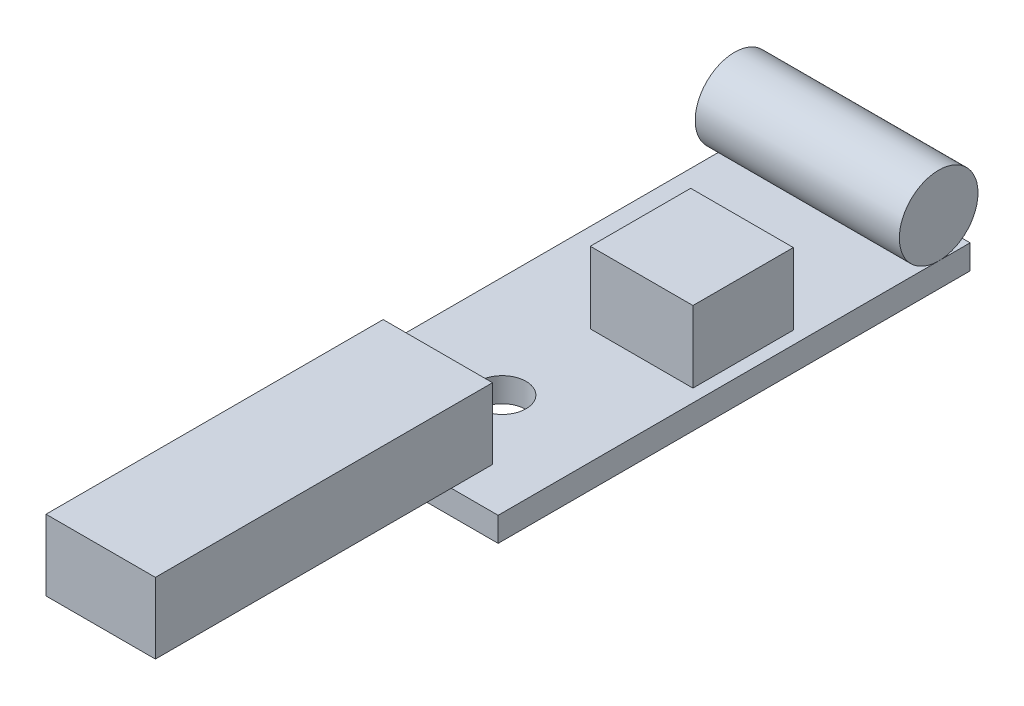
ISO-10303-21;
HEADER;
FILE_DESCRIPTION(('STEP AP214'),'2;1');
FILE_NAME('part.step','',(''),(''),'','','');
FILE_SCHEMA(('AUTOMOTIVE_DESIGN { 1 0 10303 214 1 1 1 1 }'));
ENDSEC;
DATA;
#1=APPLICATION_CONTEXT('core data for automotive mechanical design processes');
#2=APPLICATION_PROTOCOL_DEFINITION('international standard','automotive_design',2000,#1);
#3=PRODUCT_CONTEXT('',#1,'mechanical');
#4=PRODUCT('Part','Part','',(#3));
#5=PRODUCT_RELATED_PRODUCT_CATEGORY('part','',(#4));
#6=PRODUCT_DEFINITION_FORMATION('','',#4);
#7=PRODUCT_DEFINITION_CONTEXT('part definition',#1,'design');
#8=PRODUCT_DEFINITION('design','',#6,#7);
#9=PRODUCT_DEFINITION_SHAPE('','',#8);
#10=(LENGTH_UNIT() NAMED_UNIT(*) SI_UNIT(.MILLI.,.METRE.));
#11=(NAMED_UNIT(*) PLANE_ANGLE_UNIT() SI_UNIT($,.RADIAN.));
#12=(NAMED_UNIT(*) SI_UNIT($,.STERADIAN.) SOLID_ANGLE_UNIT());
#13=UNCERTAINTY_MEASURE_WITH_UNIT(LENGTH_MEASURE(1.E-05),#10,'distance_accuracy_value','');
#14=(GEOMETRIC_REPRESENTATION_CONTEXT(3) GLOBAL_UNCERTAINTY_ASSIGNED_CONTEXT((#13)) GLOBAL_UNIT_ASSIGNED_CONTEXT((#10,
#11,#12)) REPRESENTATION_CONTEXT('',''));
#15=CARTESIAN_POINT('',(0.,0.,0.));
#16=DIRECTION('',(0.,0.,1.));
#17=DIRECTION('',(1.,0.,0.));
#18=AXIS2_PLACEMENT_3D('',#15,#16,#17);
#19=CARTESIAN_POINT('',(-14.4649151416981,4.318,-13.8684));
#20=DIRECTION('',(1.,0.,0.));
#21=DIRECTION('',(0.,0.,-1.));
#22=AXIS2_PLACEMENT_3D('',#19,#20,#21);
#23=CYLINDRICAL_SURFACE('',#22,2.667);
#24=CARTESIAN_POINT('',(-6.9215,4.318,-13.8684));
#25=DIRECTION('',(1.,0.,0.));
#26=DIRECTION('',(0.,0.,-1.));
#27=AXIS2_PLACEMENT_3D('',#24,#25,#26);
#28=CIRCLE('',#27,2.667);
#29=CARTESIAN_POINT('',(-6.9215,4.318,-16.5354));
#30=VERTEX_POINT('',#29);
#31=EDGE_CURVE('E11',#30,#30,#28,.F.);
#32=ORIENTED_EDGE('',*,*,#31,.F.);
#33=EDGE_LOOP('',(#32));
#34=FACE_BOUND('',#33,.T.);
#35=CARTESIAN_POINT('',(6.9215,4.318,-13.8684));
#36=DIRECTION('',(1.,0.,0.));
#37=DIRECTION('',(0.,0.,-1.));
#38=AXIS2_PLACEMENT_3D('',#35,#36,#37);
#39=CIRCLE('',#38,2.667);
#40=CARTESIAN_POINT('',(6.9215,4.318,-16.5354));
#41=VERTEX_POINT('',#40);
#42=EDGE_CURVE('E56',#41,#41,#39,.T.);
#43=ORIENTED_EDGE('',*,*,#42,.F.);
#44=EDGE_LOOP('',(#43));
#45=FACE_BOUND('',#44,.T.);
#46=ADVANCED_FACE('F52',(#34,#45),#23,.T.);
#47=CARTESIAN_POINT('',(6.9215,4.318,-13.8684));
#48=DIRECTION('',(1.,0.,0.));
#49=DIRECTION('',(0.,0.,-1.));
#50=AXIS2_PLACEMENT_3D('',#47,#48,#49);
#51=PLANE('',#50);
#52=ORIENTED_EDGE('',*,*,#42,.T.);
#53=EDGE_LOOP('',(#52));
#54=FACE_BOUND('',#53,.T.);
#55=ADVANCED_FACE('F63',(#54),#51,.T.);
#56=CARTESIAN_POINT('',(-6.9215,1.651,16.002));
#57=DIRECTION('',(1.,0.,0.));
#58=DIRECTION('',(0.,0.,-1.));
#59=AXIS2_PLACEMENT_3D('',#56,#57,#58);
#60=PLANE('',#59);
#61=ORIENTED_EDGE('',*,*,#31,.T.);
#62=EDGE_LOOP('',(#61));
#63=FACE_BOUND('',#62,.T.);
#64=ADVANCED_FACE('F75',(#63),#60,.F.);
#65=CLOSED_SHELL('',(#46,#55,#64));
#66=MANIFOLD_SOLID_BREP('B2',#65);
#67=CARTESIAN_POINT('',(0.,1.651,0.));
#68=DIRECTION('',(0.,-1.,0.));
#69=DIRECTION('',(0.,0.,-1.));
#70=AXIS2_PLACEMENT_3D('',#67,#68,#69);
#71=PLANE('',#70);
#72=DIRECTION('',(0.,0.,-1.));
#73=VECTOR('',#72,1.);
#74=CARTESIAN_POINT('',(6.0579,1.651,-4.8768));
#75=LINE('',#74,#73);
#76=CARTESIAN_POINT('',(6.0579,1.651,1.9304));
#77=VERTEX_POINT('',#76);
#78=CARTESIAN_POINT('',(6.0579,1.651,-4.8768));
#79=VERTEX_POINT('',#78);
#80=EDGE_CURVE('E216',#77,#79,#75,.T.);
#81=ORIENTED_EDGE('',*,*,#80,.F.);
#82=DIRECTION('',(1.,0.,0.));
#83=VECTOR('',#82,1.);
#84=CARTESIAN_POINT('',(-0.901699999999997,1.651,1.9304));
#85=LINE('',#84,#83);
#86=CARTESIAN_POINT('',(-0.901699999999997,1.651,1.9304));
#87=VERTEX_POINT('',#86);
#88=EDGE_CURVE('E235',#87,#77,#85,.T.);
#89=ORIENTED_EDGE('',*,*,#88,.F.);
#90=DIRECTION('',(0.,0.,1.));
#91=VECTOR('',#90,1.);
#92=CARTESIAN_POINT('',(-0.901699999999998,1.651,-4.8768));
#93=LINE('',#92,#91);
#94=CARTESIAN_POINT('',(-0.901699999999998,1.651,-4.8768));
#95=VERTEX_POINT('',#94);
#96=EDGE_CURVE('E243',#95,#87,#93,.T.);
#97=ORIENTED_EDGE('',*,*,#96,.F.);
#98=DIRECTION('',(-1.,0.,0.));
#99=VECTOR('',#98,1.);
#100=CARTESIAN_POINT('',(-0.901699999999998,1.651,-4.8768));
#101=LINE('',#100,#99);
#102=EDGE_CURVE('E222',#79,#95,#101,.T.);
#103=ORIENTED_EDGE('',*,*,#102,.F.);
#104=EDGE_LOOP('',(#81,#89,#97,#103));
#105=FACE_BOUND('',#104,.T.);
#106=CARTESIAN_POINT('',(0.,1.651,8.8011));
#107=DIRECTION('',(0.,1.,0.));
#108=DIRECTION('',(0.,0.,1.));
#109=AXIS2_PLACEMENT_3D('',#106,#107,#108);
#110=CIRCLE('',#109,1.6129);
#111=CARTESIAN_POINT('',(0.,1.651,7.1882));
#112=VERTEX_POINT('',#111);
#113=EDGE_CURVE('E268',#112,#112,#110,.T.);
#114=ORIENTED_EDGE('',*,*,#113,.F.);
#115=EDGE_LOOP('',(#114));
#116=FACE_BOUND('',#115,.T.);
#117=DIRECTION('',(0.,0.,1.));
#118=VECTOR('',#117,1.);
#119=CARTESIAN_POINT('',(-3.6703,1.651,13.208));
#120=LINE('',#119,#118);
#121=CARTESIAN_POINT('',(-3.6703,1.651,13.208));
#122=VERTEX_POINT('',#121);
#123=CARTESIAN_POINT('',(-3.67029999999999,1.651,16.002));
#124=VERTEX_POINT('',#123);
#125=EDGE_CURVE('E340',#122,#124,#120,.T.);
#126=ORIENTED_EDGE('',*,*,#125,.F.);
#127=DIRECTION('',(-1.,0.,0.));
#128=VECTOR('',#127,1.);
#129=CARTESIAN_POINT('',(-3.6703,1.651,13.208));
#130=LINE('',#129,#128);
#131=CARTESIAN_POINT('',(3.7465,1.651,13.208));
#132=VERTEX_POINT('',#131);
#133=EDGE_CURVE('E115',#132,#122,#130,.T.);
#134=ORIENTED_EDGE('',*,*,#133,.F.);
#135=DIRECTION('',(0.,0.,-1.));
#136=VECTOR('',#135,1.);
#137=CARTESIAN_POINT('',(3.7465,1.651,13.208));
#138=LINE('',#137,#136);
#139=CARTESIAN_POINT('',(3.74650000000001,1.651,16.002));
#140=VERTEX_POINT('',#139);
#141=EDGE_CURVE('E51',#140,#132,#138,.T.);
#142=ORIENTED_EDGE('',*,*,#141,.F.);
#143=DIRECTION('',(1.,0.,0.));
#144=VECTOR('',#143,1.);
#145=CARTESIAN_POINT('',(-6.9215,1.651,16.002));
#146=LINE('',#145,#144);
#147=CARTESIAN_POINT('',(6.9215,1.651,16.002));
#148=VERTEX_POINT('',#147);
#149=EDGE_CURVE('E288',#140,#148,#146,.T.);
#150=ORIENTED_EDGE('',*,*,#149,.T.);
#151=DIRECTION('',(0.,0.,-1.));
#152=VECTOR('',#151,1.);
#153=CARTESIAN_POINT('',(6.9215,1.651,16.002));
#154=LINE('',#153,#152);
#155=CARTESIAN_POINT('',(6.9215,1.651,-16.002));
#156=VERTEX_POINT('',#155);
#157=EDGE_CURVE('E277',#148,#156,#154,.T.);
#158=ORIENTED_EDGE('',*,*,#157,.T.);
#159=DIRECTION('',(-1.,0.,0.));
#160=VECTOR('',#159,1.);
#161=CARTESIAN_POINT('',(-6.9215,1.651,-16.002));
#162=LINE('',#161,#160);
#163=CARTESIAN_POINT('',(-6.9215,1.651,-16.002));
#164=VERTEX_POINT('',#163);
#165=EDGE_CURVE('E276',#156,#164,#162,.T.);
#166=ORIENTED_EDGE('',*,*,#165,.T.);
#167=DIRECTION('',(0.,0.,1.));
#168=VECTOR('',#167,1.);
#169=CARTESIAN_POINT('',(-6.9215,1.651,16.002));
#170=LINE('',#169,#168);
#171=CARTESIAN_POINT('',(-6.9215,1.651,16.002));
#172=VERTEX_POINT('',#171);
#173=EDGE_CURVE('E284',#164,#172,#170,.T.);
#174=ORIENTED_EDGE('',*,*,#173,.T.);
#175=EDGE_CURVE('E290',#172,#124,#146,.T.);
#176=ORIENTED_EDGE('',*,*,#175,.T.);
#177=EDGE_LOOP('',(#126,#134,#142,#150,#158,#166,#174,#176));
#178=FACE_BOUND('',#177,.T.);
#179=ADVANCED_FACE('F94',(#105,#116,#178),#71,.F.);
#180=CARTESIAN_POINT('',(0.,0.,0.));
#181=DIRECTION('',(0.,-1.,0.));
#182=DIRECTION('',(0.,0.,-1.));
#183=AXIS2_PLACEMENT_3D('',#180,#181,#182);
#184=PLANE('',#183);
#185=DIRECTION('',(0.,0.,-1.));
#186=VECTOR('',#185,1.);
#187=CARTESIAN_POINT('',(6.9215,0.,16.002));
#188=LINE('',#187,#186);
#189=CARTESIAN_POINT('',(6.9215,0.,16.002));
#190=VERTEX_POINT('',#189);
#191=CARTESIAN_POINT('',(6.9215,0.,-16.002));
#192=VERTEX_POINT('',#191);
#193=EDGE_CURVE('E275',#190,#192,#188,.T.);
#194=ORIENTED_EDGE('',*,*,#193,.F.);
#195=DIRECTION('',(1.,0.,0.));
#196=VECTOR('',#195,1.);
#197=CARTESIAN_POINT('',(-6.9215,0.,16.002));
#198=LINE('',#197,#196);
#199=CARTESIAN_POINT('',(-6.9215,0.,16.002));
#200=VERTEX_POINT('',#199);
#201=EDGE_CURVE('E278',#200,#190,#198,.T.);
#202=ORIENTED_EDGE('',*,*,#201,.F.);
#203=DIRECTION('',(0.,0.,1.));
#204=VECTOR('',#203,1.);
#205=CARTESIAN_POINT('',(-6.9215,0.,16.002));
#206=LINE('',#205,#204);
#207=CARTESIAN_POINT('',(-6.9215,0.,-16.002));
#208=VERTEX_POINT('',#207);
#209=EDGE_CURVE('E296',#208,#200,#206,.T.);
#210=ORIENTED_EDGE('',*,*,#209,.F.);
#211=DIRECTION('',(-1.,0.,0.));
#212=VECTOR('',#211,1.);
#213=CARTESIAN_POINT('',(-6.9215,0.,-16.002));
#214=LINE('',#213,#212);
#215=EDGE_CURVE('E297',#192,#208,#214,.T.);
#216=ORIENTED_EDGE('',*,*,#215,.F.);
#217=EDGE_LOOP('',(#194,#202,#210,#216));
#218=FACE_BOUND('',#217,.T.);
#219=CARTESIAN_POINT('',(0.,0.,8.8011));
#220=DIRECTION('',(0.,1.,0.));
#221=DIRECTION('',(0.,0.,1.));
#222=AXIS2_PLACEMENT_3D('',#219,#220,#221);
#223=CIRCLE('',#222,1.6129);
#224=CARTESIAN_POINT('',(0.,0.,7.1882));
#225=VERTEX_POINT('',#224);
#226=EDGE_CURVE('E270',#225,#225,#223,.T.);
#227=ORIENTED_EDGE('',*,*,#226,.T.);
#228=EDGE_LOOP('',(#227));
#229=FACE_BOUND('',#228,.T.);
#230=ADVANCED_FACE('F328',(#218,#229),#184,.T.);
#231=CARTESIAN_POINT('',(6.9215,1.651,16.002));
#232=DIRECTION('',(-1.,0.,0.));
#233=DIRECTION('',(0.,0.,1.));
#234=AXIS2_PLACEMENT_3D('',#231,#232,#233);
#235=PLANE('',#234);
#236=ORIENTED_EDGE('',*,*,#193,.T.);
#237=DIRECTION('',(0.,-1.,0.));
#238=VECTOR('',#237,1.);
#239=CARTESIAN_POINT('',(6.9215,1.651,-16.002));
#240=LINE('',#239,#238);
#241=EDGE_CURVE('E98',#156,#192,#240,.T.);
#242=ORIENTED_EDGE('',*,*,#241,.F.);
#243=ORIENTED_EDGE('',*,*,#157,.F.);
#244=DIRECTION('',(0.,-1.,0.));
#245=VECTOR('',#244,1.);
#246=CARTESIAN_POINT('',(6.9215,1.651,16.002));
#247=LINE('',#246,#245);
#248=EDGE_CURVE('E292',#148,#190,#247,.T.);
#249=ORIENTED_EDGE('',*,*,#248,.T.);
#250=EDGE_LOOP('',(#236,#242,#243,#249));
#251=FACE_BOUND('',#250,.T.);
#252=ADVANCED_FACE('F96',(#251),#235,.F.);
#253=CARTESIAN_POINT('',(-6.9215,1.651,-16.002));
#254=DIRECTION('',(0.,0.,1.));
#255=DIRECTION('',(1.,0.,0.));
#256=AXIS2_PLACEMENT_3D('',#253,#254,#255);
#257=PLANE('',#256);
#258=ORIENTED_EDGE('',*,*,#215,.T.);
#259=DIRECTION('',(0.,-1.,0.));
#260=VECTOR('',#259,1.);
#261=CARTESIAN_POINT('',(-6.9215,1.651,-16.002));
#262=LINE('',#261,#260);
#263=EDGE_CURVE('E309',#164,#208,#262,.T.);
#264=ORIENTED_EDGE('',*,*,#263,.F.);
#265=ORIENTED_EDGE('',*,*,#165,.F.);
#266=ORIENTED_EDGE('',*,*,#241,.T.);
#267=EDGE_LOOP('',(#258,#264,#265,#266));
#268=FACE_BOUND('',#267,.T.);
#269=ADVANCED_FACE('F325',(#268),#257,.F.);
#270=CARTESIAN_POINT('',(-6.9215,1.651,16.002));
#271=DIRECTION('',(1.,0.,0.));
#272=DIRECTION('',(0.,0.,-1.));
#273=AXIS2_PLACEMENT_3D('',#270,#271,#272);
#274=PLANE('',#273);
#275=ORIENTED_EDGE('',*,*,#209,.T.);
#276=DIRECTION('',(0.,-1.,0.));
#277=VECTOR('',#276,1.);
#278=CARTESIAN_POINT('',(-6.9215,1.651,16.002));
#279=LINE('',#278,#277);
#280=EDGE_CURVE('E307',#172,#200,#279,.T.);
#281=ORIENTED_EDGE('',*,*,#280,.F.);
#282=ORIENTED_EDGE('',*,*,#173,.F.);
#283=ORIENTED_EDGE('',*,*,#263,.T.);
#284=EDGE_LOOP('',(#275,#281,#282,#283));
#285=FACE_BOUND('',#284,.T.);
#286=ADVANCED_FACE('F335',(#285),#274,.F.);
#287=CARTESIAN_POINT('',(-6.9215,1.651,16.002));
#288=DIRECTION('',(0.,0.,-1.));
#289=DIRECTION('',(-1.,0.,0.));
#290=AXIS2_PLACEMENT_3D('',#287,#288,#289);
#291=PLANE('',#290);
#292=ORIENTED_EDGE('',*,*,#201,.T.);
#293=ORIENTED_EDGE('',*,*,#248,.F.);
#294=ORIENTED_EDGE('',*,*,#149,.F.);
#295=EDGE_CURVE('E295',#124,#140,#146,.T.);
#296=ORIENTED_EDGE('',*,*,#295,.F.);
#297=ORIENTED_EDGE('',*,*,#175,.F.);
#298=ORIENTED_EDGE('',*,*,#280,.T.);
#299=EDGE_LOOP('',(#292,#293,#294,#296,#297,#298));
#300=FACE_BOUND('',#299,.T.);
#301=ADVANCED_FACE('F333',(#300),#291,.F.);
#302=CARTESIAN_POINT('',(0.,1.651,8.8011));
#303=DIRECTION('',(0.,-1.,0.));
#304=DIRECTION('',(0.,0.,-1.));
#305=AXIS2_PLACEMENT_3D('',#302,#303,#304);
#306=CYLINDRICAL_SURFACE('',#305,1.6129);
#307=CARTESIAN_POINT('',(0.,1.651,7.1882));
#308=CARTESIAN_POINT('',(0.,1.63380208333333,7.1882));
#309=CARTESIAN_POINT('',(0.,1.61660416666667,7.1882));
#310=CARTESIAN_POINT('',(0.,1.58220833333333,7.1882));
#311=CARTESIAN_POINT('',(0.,1.56501041666667,7.1882));
#312=CARTESIAN_POINT('',(0.,1.53061458333333,7.1882));
#313=CARTESIAN_POINT('',(0.,1.51341666666667,7.1882));
#314=CARTESIAN_POINT('',(0.,1.47902083333333,7.1882));
#315=CARTESIAN_POINT('',(0.,1.46182291666667,7.1882));
#316=CARTESIAN_POINT('',(0.,1.42742708333333,7.1882));
#317=CARTESIAN_POINT('',(0.,1.41022916666667,7.1882));
#318=CARTESIAN_POINT('',(0.,1.37583333333333,7.1882));
#319=CARTESIAN_POINT('',(0.,1.35863541666667,7.1882));
#320=CARTESIAN_POINT('',(0.,1.32423958333333,7.1882));
#321=CARTESIAN_POINT('',(0.,1.30704166666667,7.1882));
#322=CARTESIAN_POINT('',(0.,1.27264583333333,7.1882));
#323=CARTESIAN_POINT('',(0.,1.25544791666667,7.1882));
#324=CARTESIAN_POINT('',(0.,1.22105208333333,7.1882));
#325=CARTESIAN_POINT('',(0.,1.20385416666667,7.1882));
#326=CARTESIAN_POINT('',(0.,1.16945833333333,7.1882));
#327=CARTESIAN_POINT('',(0.,1.15226041666667,7.1882));
#328=CARTESIAN_POINT('',(0.,1.11786458333333,7.1882));
#329=CARTESIAN_POINT('',(0.,1.10066666666667,7.1882));
#330=CARTESIAN_POINT('',(0.,1.06627083333333,7.1882));
#331=CARTESIAN_POINT('',(0.,1.04907291666667,7.1882));
#332=CARTESIAN_POINT('',(0.,1.01467708333333,7.1882));
#333=CARTESIAN_POINT('',(0.,0.997479166666666,7.1882));
#334=CARTESIAN_POINT('',(0.,0.963083333333333,7.1882));
#335=CARTESIAN_POINT('',(0.,0.945885416666666,7.1882));
#336=CARTESIAN_POINT('',(0.,0.911489583333333,7.1882));
#337=CARTESIAN_POINT('',(0.,0.894291666666666,7.1882));
#338=CARTESIAN_POINT('',(0.,0.859895833333333,7.1882));
#339=CARTESIAN_POINT('',(0.,0.842697916666666,7.1882));
#340=CARTESIAN_POINT('',(0.,0.808302083333333,7.1882));
#341=CARTESIAN_POINT('',(0.,0.791104166666666,7.1882));
#342=CARTESIAN_POINT('',(0.,0.756708333333333,7.1882));
#343=CARTESIAN_POINT('',(0.,0.739510416666667,7.1882));
#344=CARTESIAN_POINT('',(0.,0.705114583333333,7.1882));
#345=CARTESIAN_POINT('',(0.,0.687916666666667,7.1882));
#346=CARTESIAN_POINT('',(0.,0.653520833333333,7.1882));
#347=CARTESIAN_POINT('',(0.,0.636322916666667,7.1882));
#348=CARTESIAN_POINT('',(0.,0.601927083333333,7.1882));
#349=CARTESIAN_POINT('',(0.,0.584729166666667,7.1882));
#350=CARTESIAN_POINT('',(0.,0.550333333333333,7.1882));
#351=CARTESIAN_POINT('',(0.,0.533135416666667,7.1882));
#352=CARTESIAN_POINT('',(0.,0.498739583333333,7.1882));
#353=CARTESIAN_POINT('',(0.,0.481541666666667,7.1882));
#354=CARTESIAN_POINT('',(0.,0.447145833333333,7.1882));
#355=CARTESIAN_POINT('',(0.,0.429947916666667,7.1882));
#356=CARTESIAN_POINT('',(0.,0.395552083333333,7.1882));
#357=CARTESIAN_POINT('',(0.,0.378354166666667,7.1882));
#358=CARTESIAN_POINT('',(0.,0.343958333333333,7.1882));
#359=CARTESIAN_POINT('',(0.,0.326760416666667,7.1882));
#360=CARTESIAN_POINT('',(0.,0.292364583333333,7.1882));
#361=CARTESIAN_POINT('',(0.,0.275166666666667,7.1882));
#362=CARTESIAN_POINT('',(0.,0.240770833333333,7.1882));
#363=CARTESIAN_POINT('',(0.,0.223572916666667,7.1882));
#364=CARTESIAN_POINT('',(0.,0.189177083333333,7.1882));
#365=CARTESIAN_POINT('',(0.,0.171979166666667,7.1882));
#366=CARTESIAN_POINT('',(0.,0.137583333333333,7.1882));
#367=CARTESIAN_POINT('',(0.,0.120385416666667,7.1882));
#368=CARTESIAN_POINT('',(0.,0.0859895833333333,7.1882));
#369=CARTESIAN_POINT('',(0.,0.0687916666666667,7.1882));
#370=CARTESIAN_POINT('',(0.,0.0343958333333333,7.1882));
#371=CARTESIAN_POINT('',(0.,0.0171979166666666,7.1882));
#372=CARTESIAN_POINT('',(0.,0.,7.1882));
#373=B_SPLINE_CURVE_WITH_KNOTS('',3,(#307,#308,#309,#310,#311,#312,#313,#314,#315,#316,#317,
#318,#319,#320,#321,#322,#323,#324,#325,#326,#327,#328,#329,#330,#331,#332,#333,#334,#335,#336,
#337,#338,#339,#340,#341,#342,#343,#344,#345,#346,#347,#348,#349,#350,#351,#352,#353,#354,#355,
#356,#357,#358,#359,#360,#361,#362,#363,#364,#365,#366,#367,#368,#369,#370,#371,#372),
.UNSPECIFIED.,.F.,.F.,(4,2,2,2,2,2,2,2,2,2,2,2,2,2,2,2,2,2,2,2,2,2,2,2,2,2,2,2,2,2,2,2,4),(0.,
0.0515937500000002,0.1031875,0.15478125,0.206375,0.25796875,0.3095625,0.36115625,0.41275,
0.46434375,0.5159375,0.56753125,0.619125,0.67071875,0.7223125,0.77390625,0.8255,0.87709375,
0.9286875,0.98028125,1.031875,1.08346875,1.1350625,1.18665625,1.23825,1.28984375,1.3414375,
1.39303125,1.444625,1.49621875,1.5478125,1.59940625,1.651),.UNSPECIFIED.);
#374=EDGE_CURVE('BSEAM383',#112,#225,#373,.T.);
#375=ORIENTED_EDGE('',*,*,#113,.T.);
#376=ORIENTED_EDGE('',*,*,#226,.F.);
#377=ORIENTED_EDGE('',*,*,#374,.T.);
#378=ORIENTED_EDGE('',*,*,#374,.F.);
#379=EDGE_LOOP('',(#375,#377,#376,#378));
#380=FACE_BOUND('',#379,.T.);
#381=ADVANCED_FACE('F383',(#380),#306,.F.);
#382=CARTESIAN_POINT('',(6.0579,6.5024,-4.8768));
#383=DIRECTION('',(-1.,0.,0.));
#384=DIRECTION('',(0.,0.,1.));
#385=AXIS2_PLACEMENT_3D('',#382,#383,#384);
#386=PLANE('',#385);
#387=ORIENTED_EDGE('',*,*,#80,.T.);
#388=DIRECTION('',(0.,-1.,0.));
#389=VECTOR('',#388,1.);
#390=CARTESIAN_POINT('',(6.0579,6.5024,-4.8768));
#391=LINE('',#390,#389);
#392=CARTESIAN_POINT('',(6.0579,6.5024,-4.8768));
#393=VERTEX_POINT('',#392);
#394=EDGE_CURVE('E263',#393,#79,#391,.T.);
#395=ORIENTED_EDGE('',*,*,#394,.F.);
#396=DIRECTION('',(0.,0.,-1.));
#397=VECTOR('',#396,1.);
#398=CARTESIAN_POINT('',(6.0579,6.5024,-4.8768));
#399=LINE('',#398,#397);
#400=CARTESIAN_POINT('',(6.0579,6.5024,1.9304));
#401=VERTEX_POINT('',#400);
#402=EDGE_CURVE('E230',#401,#393,#399,.T.);
#403=ORIENTED_EDGE('',*,*,#402,.F.);
#404=DIRECTION('',(0.,-1.,0.));
#405=VECTOR('',#404,1.);
#406=CARTESIAN_POINT('',(6.0579,6.5024,1.9304));
#407=LINE('',#406,#405);
#408=EDGE_CURVE('E238',#401,#77,#407,.T.);
#409=ORIENTED_EDGE('',*,*,#408,.T.);
#410=EDGE_LOOP('',(#387,#395,#403,#409));
#411=FACE_BOUND('',#410,.T.);
#412=ADVANCED_FACE('F406',(#411),#386,.F.);
#413=CARTESIAN_POINT('',(-0.901699999999998,6.5024,-4.8768));
#414=DIRECTION('',(0.,0.,1.));
#415=DIRECTION('',(1.,0.,0.));
#416=AXIS2_PLACEMENT_3D('',#413,#414,#415);
#417=PLANE('',#416);
#418=ORIENTED_EDGE('',*,*,#102,.T.);
#419=DIRECTION('',(0.,-1.,0.));
#420=VECTOR('',#419,1.);
#421=CARTESIAN_POINT('',(-0.901699999999998,6.5024,-4.8768));
#422=LINE('',#421,#420);
#423=CARTESIAN_POINT('',(-0.901699999999998,6.5024,-4.8768));
#424=VERTEX_POINT('',#423);
#425=EDGE_CURVE('E259',#424,#95,#422,.T.);
#426=ORIENTED_EDGE('',*,*,#425,.F.);
#427=DIRECTION('',(-1.,0.,0.));
#428=VECTOR('',#427,1.);
#429=CARTESIAN_POINT('',(-0.901699999999998,6.5024,-4.8768));
#430=LINE('',#429,#428);
#431=EDGE_CURVE('E233',#393,#424,#430,.T.);
#432=ORIENTED_EDGE('',*,*,#431,.F.);
#433=ORIENTED_EDGE('',*,*,#394,.T.);
#434=EDGE_LOOP('',(#418,#426,#432,#433));
#435=FACE_BOUND('',#434,.T.);
#436=ADVANCED_FACE('F411',(#435),#417,.F.);
#437=CARTESIAN_POINT('',(-0.901699999999998,6.5024,-4.8768));
#438=DIRECTION('',(1.,0.,0.));
#439=DIRECTION('',(0.,0.,-1.));
#440=AXIS2_PLACEMENT_3D('',#437,#438,#439);
#441=PLANE('',#440);
#442=ORIENTED_EDGE('',*,*,#96,.T.);
#443=DIRECTION('',(0.,-1.,0.));
#444=VECTOR('',#443,1.);
#445=CARTESIAN_POINT('',(-0.901699999999997,6.5024,1.9304));
#446=LINE('',#445,#444);
#447=CARTESIAN_POINT('',(-0.901699999999997,6.5024,1.9304));
#448=VERTEX_POINT('',#447);
#449=EDGE_CURVE('E254',#448,#87,#446,.T.);
#450=ORIENTED_EDGE('',*,*,#449,.F.);
#451=DIRECTION('',(0.,0.,1.));
#452=VECTOR('',#451,1.);
#453=CARTESIAN_POINT('',(-0.901699999999998,6.5024,-4.8768));
#454=LINE('',#453,#452);
#455=EDGE_CURVE('E234',#424,#448,#454,.T.);
#456=ORIENTED_EDGE('',*,*,#455,.F.);
#457=ORIENTED_EDGE('',*,*,#425,.T.);
#458=EDGE_LOOP('',(#442,#450,#456,#457));
#459=FACE_BOUND('',#458,.T.);
#460=ADVANCED_FACE('F423',(#459),#441,.F.);
#461=CARTESIAN_POINT('',(-0.901699999999997,6.5024,1.9304));
#462=DIRECTION('',(0.,0.,-1.));
#463=DIRECTION('',(-1.,0.,0.));
#464=AXIS2_PLACEMENT_3D('',#461,#462,#463);
#465=PLANE('',#464);
#466=ORIENTED_EDGE('',*,*,#88,.T.);
#467=ORIENTED_EDGE('',*,*,#408,.F.);
#468=DIRECTION('',(1.,0.,0.));
#469=VECTOR('',#468,1.);
#470=CARTESIAN_POINT('',(-0.901699999999997,6.5024,1.9304));
#471=LINE('',#470,#469);
#472=EDGE_CURVE('E236',#448,#401,#471,.T.);
#473=ORIENTED_EDGE('',*,*,#472,.F.);
#474=ORIENTED_EDGE('',*,*,#449,.T.);
#475=EDGE_LOOP('',(#466,#467,#473,#474));
#476=FACE_BOUND('',#475,.T.);
#477=ADVANCED_FACE('F429',(#476),#465,.F.);
#478=CARTESIAN_POINT('',(0.,6.5024,0.));
#479=DIRECTION('',(0.,1.,0.));
#480=DIRECTION('',(0.,0.,1.));
#481=AXIS2_PLACEMENT_3D('',#478,#479,#480);
#482=PLANE('',#481);
#483=ORIENTED_EDGE('',*,*,#402,.T.);
#484=ORIENTED_EDGE('',*,*,#431,.T.);
#485=ORIENTED_EDGE('',*,*,#455,.T.);
#486=ORIENTED_EDGE('',*,*,#472,.T.);
#487=EDGE_LOOP('',(#483,#484,#485,#486));
#488=FACE_BOUND('',#487,.T.);
#489=ADVANCED_FACE('F437',(#488),#482,.T.);
#490=CARTESIAN_POINT('',(0.,1.651,0.));
#491=DIRECTION('',(0.,1.,0.));
#492=DIRECTION('',(0.,0.,1.));
#493=AXIS2_PLACEMENT_3D('',#490,#491,#492);
#494=PLANE('',#493);
#495=CARTESIAN_POINT('',(-3.67029999999999,1.651,36.068));
#496=VERTEX_POINT('',#495);
#497=EDGE_CURVE('E213',#124,#496,#120,.T.);
#498=ORIENTED_EDGE('',*,*,#497,.F.);
#499=ORIENTED_EDGE('',*,*,#295,.T.);
#500=CARTESIAN_POINT('',(3.74650000000001,1.651,36.068));
#501=VERTEX_POINT('',#500);
#502=EDGE_CURVE('E104',#501,#140,#138,.T.);
#503=ORIENTED_EDGE('',*,*,#502,.F.);
#504=DIRECTION('',(1.,0.,0.));
#505=VECTOR('',#504,1.);
#506=CARTESIAN_POINT('',(-3.67029999999999,1.651,36.068));
#507=LINE('',#506,#505);
#508=EDGE_CURVE('E345',#496,#501,#507,.T.);
#509=ORIENTED_EDGE('',*,*,#508,.F.);
#510=EDGE_LOOP('',(#498,#499,#503,#509));
#511=FACE_BOUND('',#510,.T.);
#512=ADVANCED_FACE('F336',(#511),#494,.F.);
#513=CARTESIAN_POINT('',(-3.6703,6.4516,13.208));
#514=DIRECTION('',(1.,0.,0.));
#515=DIRECTION('',(0.,0.,-1.));
#516=AXIS2_PLACEMENT_3D('',#513,#514,#515);
#517=PLANE('',#516);
#518=ORIENTED_EDGE('',*,*,#125,.T.);
#519=ORIENTED_EDGE('',*,*,#497,.T.);
#520=DIRECTION('',(0.,-1.,0.));
#521=VECTOR('',#520,1.);
#522=CARTESIAN_POINT('',(-3.67029999999999,6.4516,36.068));
#523=LINE('',#522,#521);
#524=CARTESIAN_POINT('',(-3.67029999999999,6.4516,36.068));
#525=VERTEX_POINT('',#524);
#526=EDGE_CURVE('E195',#525,#496,#523,.T.);
#527=ORIENTED_EDGE('',*,*,#526,.F.);
#528=DIRECTION('',(0.,0.,1.));
#529=VECTOR('',#528,1.);
#530=CARTESIAN_POINT('',(-3.6703,6.4516,13.208));
#531=LINE('',#530,#529);
#532=CARTESIAN_POINT('',(-3.6703,6.4516,13.208));
#533=VERTEX_POINT('',#532);
#534=EDGE_CURVE('E200',#533,#525,#531,.T.);
#535=ORIENTED_EDGE('',*,*,#534,.F.);
#536=DIRECTION('',(0.,-1.,0.));
#537=VECTOR('',#536,1.);
#538=CARTESIAN_POINT('',(-3.6703,6.4516,13.208));
#539=LINE('',#538,#537);
#540=EDGE_CURVE('E344',#533,#122,#539,.T.);
#541=ORIENTED_EDGE('',*,*,#540,.T.);
#542=EDGE_LOOP('',(#518,#519,#527,#535,#541));
#543=FACE_BOUND('',#542,.T.);
#544=ADVANCED_FACE('F211',(#543),#517,.F.);
#545=CARTESIAN_POINT('',(-3.67029999999999,6.4516,36.068));
#546=DIRECTION('',(0.,0.,-1.));
#547=DIRECTION('',(-1.,0.,0.));
#548=AXIS2_PLACEMENT_3D('',#545,#546,#547);
#549=PLANE('',#548);
#550=ORIENTED_EDGE('',*,*,#508,.T.);
#551=DIRECTION('',(0.,-1.,0.));
#552=VECTOR('',#551,1.);
#553=CARTESIAN_POINT('',(3.74650000000001,6.4516,36.068));
#554=LINE('',#553,#552);
#555=CARTESIAN_POINT('',(3.74650000000001,6.4516,36.068));
#556=VERTEX_POINT('',#555);
#557=EDGE_CURVE('E192',#556,#501,#554,.T.);
#558=ORIENTED_EDGE('',*,*,#557,.F.);
#559=DIRECTION('',(1.,0.,0.));
#560=VECTOR('',#559,1.);
#561=CARTESIAN_POINT('',(-3.67029999999999,6.4516,36.068));
#562=LINE('',#561,#560);
#563=EDGE_CURVE('E189',#525,#556,#562,.T.);
#564=ORIENTED_EDGE('',*,*,#563,.F.);
#565=ORIENTED_EDGE('',*,*,#526,.T.);
#566=EDGE_LOOP('',(#550,#558,#564,#565));
#567=FACE_BOUND('',#566,.T.);
#568=ADVANCED_FACE('F188',(#567),#549,.F.);
#569=CARTESIAN_POINT('',(3.7465,6.4516,13.208));
#570=DIRECTION('',(-1.,0.,0.));
#571=DIRECTION('',(0.,0.,1.));
#572=AXIS2_PLACEMENT_3D('',#569,#570,#571);
#573=PLANE('',#572);
#574=ORIENTED_EDGE('',*,*,#502,.T.);
#575=ORIENTED_EDGE('',*,*,#141,.T.);
#576=DIRECTION('',(0.,-1.,0.));
#577=VECTOR('',#576,1.);
#578=CARTESIAN_POINT('',(3.7465,6.4516,13.208));
#579=LINE('',#578,#577);
#580=CARTESIAN_POINT('',(3.7465,6.4516,13.208));
#581=VERTEX_POINT('',#580);
#582=EDGE_CURVE('E224',#581,#132,#579,.T.);
#583=ORIENTED_EDGE('',*,*,#582,.F.);
#584=DIRECTION('',(0.,0.,-1.));
#585=VECTOR('',#584,1.);
#586=CARTESIAN_POINT('',(3.7465,6.4516,13.208));
#587=LINE('',#586,#585);
#588=EDGE_CURVE('E196',#556,#581,#587,.T.);
#589=ORIENTED_EDGE('',*,*,#588,.F.);
#590=ORIENTED_EDGE('',*,*,#557,.T.);
#591=EDGE_LOOP('',(#574,#575,#583,#589,#590));
#592=FACE_BOUND('',#591,.T.);
#593=ADVANCED_FACE('F362',(#592),#573,.F.);
#594=CARTESIAN_POINT('',(-3.6703,6.4516,13.208));
#595=DIRECTION('',(0.,0.,1.));
#596=DIRECTION('',(1.,0.,0.));
#597=AXIS2_PLACEMENT_3D('',#594,#595,#596);
#598=PLANE('',#597);
#599=ORIENTED_EDGE('',*,*,#133,.T.);
#600=ORIENTED_EDGE('',*,*,#540,.F.);
#601=DIRECTION('',(-1.,0.,0.));
#602=VECTOR('',#601,1.);
#603=CARTESIAN_POINT('',(-3.6703,6.4516,13.208));
#604=LINE('',#603,#602);
#605=EDGE_CURVE('E204',#581,#533,#604,.T.);
#606=ORIENTED_EDGE('',*,*,#605,.F.);
#607=ORIENTED_EDGE('',*,*,#582,.T.);
#608=EDGE_LOOP('',(#599,#600,#606,#607));
#609=FACE_BOUND('',#608,.T.);
#610=ADVANCED_FACE('F359',(#609),#598,.F.);
#611=CARTESIAN_POINT('',(0.,6.4516,0.));
#612=DIRECTION('',(0.,1.,0.));
#613=DIRECTION('',(0.,0.,1.));
#614=AXIS2_PLACEMENT_3D('',#611,#612,#613);
#615=PLANE('',#614);
#616=ORIENTED_EDGE('',*,*,#534,.T.);
#617=ORIENTED_EDGE('',*,*,#563,.T.);
#618=ORIENTED_EDGE('',*,*,#588,.T.);
#619=ORIENTED_EDGE('',*,*,#605,.T.);
#620=EDGE_LOOP('',(#616,#617,#618,#619));
#621=FACE_BOUND('',#620,.T.);
#622=ADVANCED_FACE('F205',(#621),#615,.T.);
#623=CLOSED_SHELL('',(#179,#230,#252,#269,#286,#301,#381,#412,#436,#460,#477,#489,#512,#544,
#568,#593,#610,#622));
#624=MANIFOLD_SOLID_BREP('B6',#623);
#625=ADVANCED_BREP_SHAPE_REPRESENTATION('',(#18,#66,#624),#14);
#626=SHAPE_DEFINITION_REPRESENTATION(#9,#625);
ENDSEC;
END-ISO-10303-21;
